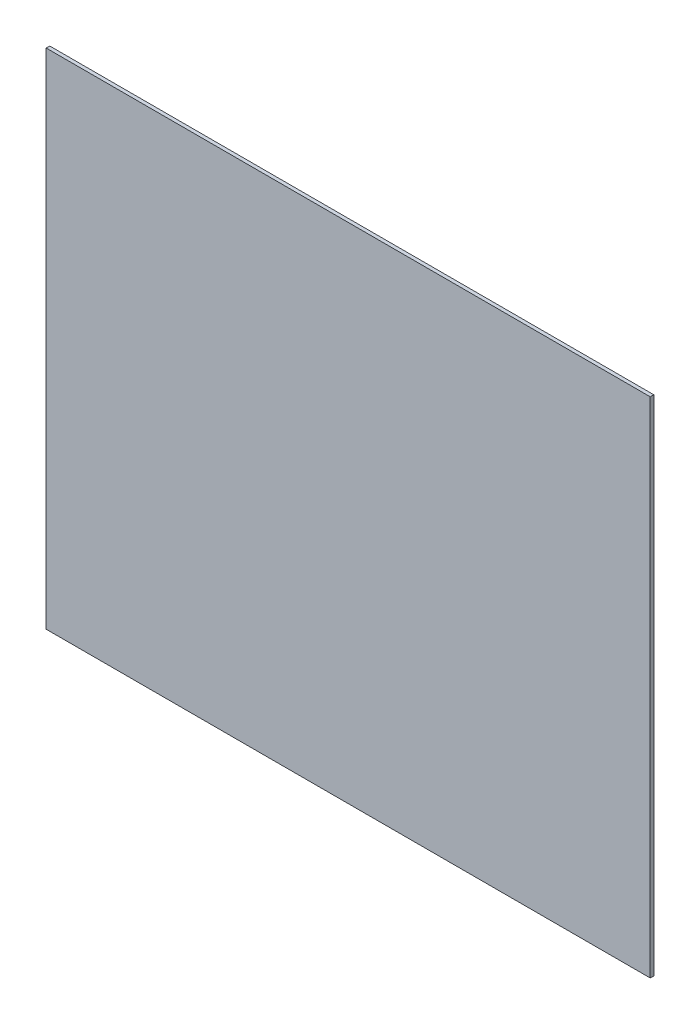
ISO-10303-21;
HEADER;
FILE_DESCRIPTION(('STEP AP214'),'2;1');
FILE_NAME('part.step','',(''),(''),'','','');
FILE_SCHEMA(('AUTOMOTIVE_DESIGN { 1 0 10303 214 1 1 1 1 }'));
ENDSEC;
DATA;
#1=APPLICATION_CONTEXT('core data for automotive mechanical design processes');
#2=APPLICATION_PROTOCOL_DEFINITION('international standard','automotive_design',2000,#1);
#3=PRODUCT_CONTEXT('',#1,'mechanical');
#4=PRODUCT('Part','Part','',(#3));
#5=PRODUCT_RELATED_PRODUCT_CATEGORY('part','',(#4));
#6=PRODUCT_DEFINITION_FORMATION('','',#4);
#7=PRODUCT_DEFINITION_CONTEXT('part definition',#1,'design');
#8=PRODUCT_DEFINITION('design','',#6,#7);
#9=PRODUCT_DEFINITION_SHAPE('','',#8);
#10=(LENGTH_UNIT() NAMED_UNIT(*) SI_UNIT(.MILLI.,.METRE.));
#11=(NAMED_UNIT(*) PLANE_ANGLE_UNIT() SI_UNIT($,.RADIAN.));
#12=(NAMED_UNIT(*) SI_UNIT($,.STERADIAN.) SOLID_ANGLE_UNIT());
#13=UNCERTAINTY_MEASURE_WITH_UNIT(LENGTH_MEASURE(1.E-05),#10,'distance_accuracy_value','');
#14=(GEOMETRIC_REPRESENTATION_CONTEXT(3) GLOBAL_UNCERTAINTY_ASSIGNED_CONTEXT((#13)) GLOBAL_UNIT_ASSIGNED_CONTEXT((#10,
#11,#12)) REPRESENTATION_CONTEXT('',''));
#15=CARTESIAN_POINT('',(0.,0.,0.));
#16=DIRECTION('',(0.,0.,1.));
#17=DIRECTION('',(1.,0.,0.));
#18=AXIS2_PLACEMENT_3D('',#15,#16,#17);
#19=CARTESIAN_POINT('',(255.,212.5,3.));
#20=DIRECTION('',(-1.,0.,0.));
#21=DIRECTION('',(0.,0.,1.));
#22=AXIS2_PLACEMENT_3D('',#19,#20,#21);
#23=PLANE('',#22);
#24=DIRECTION('',(0.,1.,0.));
#25=VECTOR('',#24,1.);
#26=CARTESIAN_POINT('',(255.,212.5,0.));
#27=LINE('',#26,#25);
#28=CARTESIAN_POINT('',(255.,-212.5,0.));
#29=VERTEX_POINT('',#28);
#30=CARTESIAN_POINT('',(255.,212.5,0.));
#31=VERTEX_POINT('',#30);
#32=EDGE_CURVE('E96',#29,#31,#27,.T.);
#33=ORIENTED_EDGE('',*,*,#32,.T.);
#34=DIRECTION('',(0.,0.,-1.));
#35=VECTOR('',#34,1.);
#36=CARTESIAN_POINT('',(255.,212.5,3.));
#37=LINE('',#36,#35);
#38=CARTESIAN_POINT('',(255.,212.5,3.));
#39=VERTEX_POINT('',#38);
#40=EDGE_CURVE('E11',#39,#31,#37,.T.);
#41=ORIENTED_EDGE('',*,*,#40,.F.);
#42=DIRECTION('',(0.,1.,0.));
#43=VECTOR('',#42,1.);
#44=CARTESIAN_POINT('',(255.,212.5,3.));
#45=LINE('',#44,#43);
#46=CARTESIAN_POINT('',(255.,-212.5,3.));
#47=VERTEX_POINT('',#46);
#48=EDGE_CURVE('E84',#47,#39,#45,.T.);
#49=ORIENTED_EDGE('',*,*,#48,.F.);
#50=DIRECTION('',(0.,0.,-1.));
#51=VECTOR('',#50,1.);
#52=CARTESIAN_POINT('',(255.,-212.5,3.));
#53=LINE('',#52,#51);
#54=EDGE_CURVE('E92',#47,#29,#53,.T.);
#55=ORIENTED_EDGE('',*,*,#54,.T.);
#56=EDGE_LOOP('',(#33,#41,#49,#55));
#57=FACE_BOUND('',#56,.T.);
#58=ADVANCED_FACE('F33',(#57),#23,.F.);
#59=CARTESIAN_POINT('',(-255.,212.5,3.));
#60=DIRECTION('',(0.,-1.,0.));
#61=DIRECTION('',(0.,0.,-1.));
#62=AXIS2_PLACEMENT_3D('',#59,#60,#61);
#63=PLANE('',#62);
#64=DIRECTION('',(-1.,0.,0.));
#65=VECTOR('',#64,1.);
#66=CARTESIAN_POINT('',(-255.,212.5,0.));
#67=LINE('',#66,#65);
#68=CARTESIAN_POINT('',(-255.,212.5,0.));
#69=VERTEX_POINT('',#68);
#70=EDGE_CURVE('E88',#31,#69,#67,.T.);
#71=ORIENTED_EDGE('',*,*,#70,.T.);
#72=DIRECTION('',(0.,0.,-1.));
#73=VECTOR('',#72,1.);
#74=CARTESIAN_POINT('',(-255.,212.5,3.));
#75=LINE('',#74,#73);
#76=CARTESIAN_POINT('',(-255.,212.5,3.));
#77=VERTEX_POINT('',#76);
#78=EDGE_CURVE('E41',#77,#69,#75,.T.);
#79=ORIENTED_EDGE('',*,*,#78,.F.);
#80=DIRECTION('',(-1.,0.,0.));
#81=VECTOR('',#80,1.);
#82=CARTESIAN_POINT('',(-255.,212.5,3.));
#83=LINE('',#82,#81);
#84=EDGE_CURVE('E79',#39,#77,#83,.T.);
#85=ORIENTED_EDGE('',*,*,#84,.F.);
#86=ORIENTED_EDGE('',*,*,#40,.T.);
#87=EDGE_LOOP('',(#71,#79,#85,#86));
#88=FACE_BOUND('',#87,.T.);
#89=ADVANCED_FACE('F87',(#88),#63,.F.);
#90=CARTESIAN_POINT('',(-255.,212.5,3.));
#91=DIRECTION('',(1.,0.,0.));
#92=DIRECTION('',(0.,0.,-1.));
#93=AXIS2_PLACEMENT_3D('',#90,#91,#92);
#94=PLANE('',#93);
#95=DIRECTION('',(0.,-1.,0.));
#96=VECTOR('',#95,1.);
#97=CARTESIAN_POINT('',(-255.,212.5,0.));
#98=LINE('',#97,#96);
#99=CARTESIAN_POINT('',(-255.,-212.5,0.));
#100=VERTEX_POINT('',#99);
#101=EDGE_CURVE('E66',#69,#100,#98,.T.);
#102=ORIENTED_EDGE('',*,*,#101,.T.);
#103=DIRECTION('',(0.,0.,-1.));
#104=VECTOR('',#103,1.);
#105=CARTESIAN_POINT('',(-255.,-212.5,3.));
#106=LINE('',#105,#104);
#107=CARTESIAN_POINT('',(-255.,-212.5,3.));
#108=VERTEX_POINT('',#107);
#109=EDGE_CURVE('E89',#108,#100,#106,.T.);
#110=ORIENTED_EDGE('',*,*,#109,.F.);
#111=DIRECTION('',(0.,-1.,0.));
#112=VECTOR('',#111,1.);
#113=CARTESIAN_POINT('',(-255.,212.5,3.));
#114=LINE('',#113,#112);
#115=EDGE_CURVE('E82',#77,#108,#114,.T.);
#116=ORIENTED_EDGE('',*,*,#115,.F.);
#117=ORIENTED_EDGE('',*,*,#78,.T.);
#118=EDGE_LOOP('',(#102,#110,#116,#117));
#119=FACE_BOUND('',#118,.T.);
#120=ADVANCED_FACE('F90',(#119),#94,.F.);
#121=CARTESIAN_POINT('',(-255.,-212.5,3.));
#122=DIRECTION('',(0.,1.,0.));
#123=DIRECTION('',(0.,0.,1.));
#124=AXIS2_PLACEMENT_3D('',#121,#122,#123);
#125=PLANE('',#124);
#126=DIRECTION('',(1.,0.,0.));
#127=VECTOR('',#126,1.);
#128=CARTESIAN_POINT('',(-255.,-212.5,0.));
#129=LINE('',#128,#127);
#130=EDGE_CURVE('E72',#100,#29,#129,.T.);
#131=ORIENTED_EDGE('',*,*,#130,.T.);
#132=ORIENTED_EDGE('',*,*,#54,.F.);
#133=DIRECTION('',(1.,0.,0.));
#134=VECTOR('',#133,1.);
#135=CARTESIAN_POINT('',(-255.,-212.5,3.));
#136=LINE('',#135,#134);
#137=EDGE_CURVE('E49',#108,#47,#136,.T.);
#138=ORIENTED_EDGE('',*,*,#137,.F.);
#139=ORIENTED_EDGE('',*,*,#109,.T.);
#140=EDGE_LOOP('',(#131,#132,#138,#139));
#141=FACE_BOUND('',#140,.T.);
#142=ADVANCED_FACE('F103',(#141),#125,.F.);
#143=CARTESIAN_POINT('',(0.,0.,3.));
#144=DIRECTION('',(0.,0.,1.));
#145=DIRECTION('',(1.,0.,0.));
#146=AXIS2_PLACEMENT_3D('',#143,#144,#145);
#147=PLANE('',#146);
#148=ORIENTED_EDGE('',*,*,#48,.T.);
#149=ORIENTED_EDGE('',*,*,#84,.T.);
#150=ORIENTED_EDGE('',*,*,#115,.T.);
#151=ORIENTED_EDGE('',*,*,#137,.T.);
#152=EDGE_LOOP('',(#148,#149,#150,#151));
#153=FACE_BOUND('',#152,.T.);
#154=ADVANCED_FACE('F80',(#153),#147,.T.);
#155=CARTESIAN_POINT('',(0.,0.,0.));
#156=DIRECTION('',(0.,0.,1.));
#157=DIRECTION('',(1.,0.,0.));
#158=AXIS2_PLACEMENT_3D('',#155,#156,#157);
#159=PLANE('',#158);
#160=ORIENTED_EDGE('',*,*,#32,.F.);
#161=ORIENTED_EDGE('',*,*,#130,.F.);
#162=ORIENTED_EDGE('',*,*,#101,.F.);
#163=ORIENTED_EDGE('',*,*,#70,.F.);
#164=EDGE_LOOP('',(#160,#161,#162,#163));
#165=FACE_BOUND('',#164,.T.);
#166=ADVANCED_FACE('F106',(#165),#159,.F.);
#167=CLOSED_SHELL('',(#58,#89,#120,#142,#154,#166));
#168=MANIFOLD_SOLID_BREP('B2',#167);
#169=ADVANCED_BREP_SHAPE_REPRESENTATION('',(#18,#168),#14);
#170=SHAPE_DEFINITION_REPRESENTATION(#9,#169);
ENDSEC;
END-ISO-10303-21;
